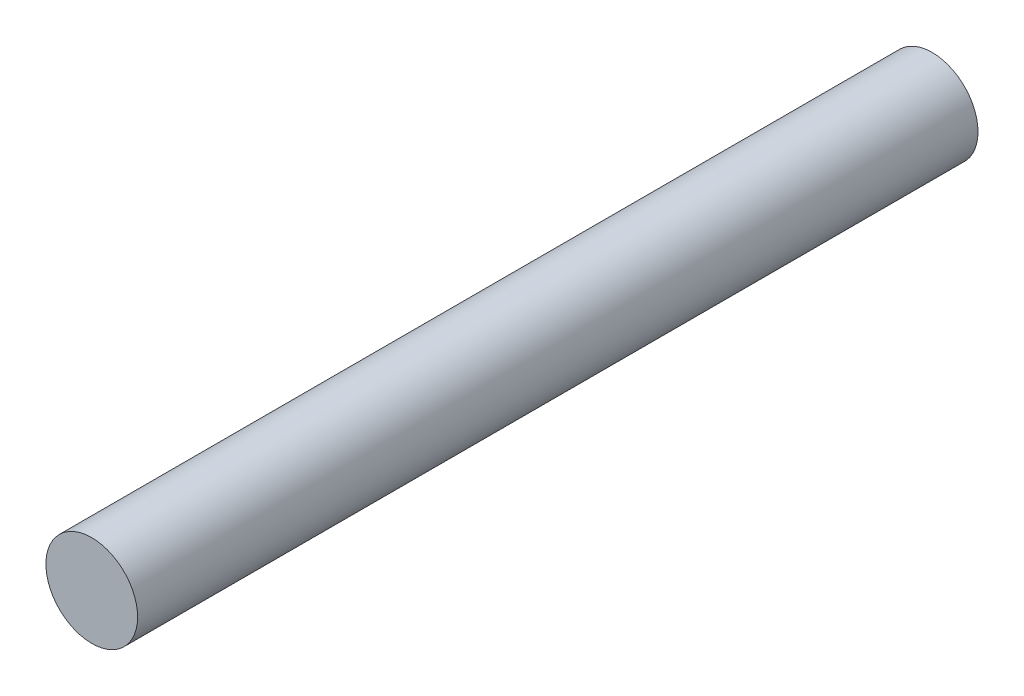
ISO-10303-21;
HEADER;
FILE_DESCRIPTION(('STEP AP214'),'2;1');
FILE_NAME('part.step','',(''),(''),'','','');
FILE_SCHEMA(('AUTOMOTIVE_DESIGN { 1 0 10303 214 1 1 1 1 }'));
ENDSEC;
DATA;
#1=APPLICATION_CONTEXT('core data for automotive mechanical design processes');
#2=APPLICATION_PROTOCOL_DEFINITION('international standard','automotive_design',2000,#1);
#3=PRODUCT_CONTEXT('',#1,'mechanical');
#4=PRODUCT('Part','Part','',(#3));
#5=PRODUCT_RELATED_PRODUCT_CATEGORY('part','',(#4));
#6=PRODUCT_DEFINITION_FORMATION('','',#4);
#7=PRODUCT_DEFINITION_CONTEXT('part definition',#1,'design');
#8=PRODUCT_DEFINITION('design','',#6,#7);
#9=PRODUCT_DEFINITION_SHAPE('','',#8);
#10=(LENGTH_UNIT() NAMED_UNIT(*) SI_UNIT(.MILLI.,.METRE.));
#11=(NAMED_UNIT(*) PLANE_ANGLE_UNIT() SI_UNIT($,.RADIAN.));
#12=(NAMED_UNIT(*) SI_UNIT($,.STERADIAN.) SOLID_ANGLE_UNIT());
#13=UNCERTAINTY_MEASURE_WITH_UNIT(LENGTH_MEASURE(1.E-05),#10,'distance_accuracy_value','');
#14=(GEOMETRIC_REPRESENTATION_CONTEXT(3) GLOBAL_UNCERTAINTY_ASSIGNED_CONTEXT((#13)) GLOBAL_UNIT_ASSIGNED_CONTEXT((#10,
#11,#12)) REPRESENTATION_CONTEXT('',''));
#15=CARTESIAN_POINT('',(0.,0.,0.));
#16=DIRECTION('',(0.,0.,1.));
#17=DIRECTION('',(1.,0.,0.));
#18=AXIS2_PLACEMENT_3D('',#15,#16,#17);
#19=CARTESIAN_POINT('',(0.,0.,44.));
#20=DIRECTION('',(0.,0.,-1.));
#21=DIRECTION('',(-1.,0.,0.));
#22=AXIS2_PLACEMENT_3D('',#19,#20,#21);
#23=CYLINDRICAL_SURFACE('',#22,2.4);
#24=CARTESIAN_POINT('',(0.,0.,44.));
#25=DIRECTION('',(0.,0.,1.));
#26=DIRECTION('',(1.,0.,0.));
#27=AXIS2_PLACEMENT_3D('',#24,#25,#26);
#28=CIRCLE('',#27,2.4);
#29=CARTESIAN_POINT('',(2.4,0.,44.));
#30=VERTEX_POINT('',#29);
#31=EDGE_CURVE('E10',#30,#30,#28,.T.);
#32=ORIENTED_EDGE('',*,*,#31,.F.);
#33=EDGE_LOOP('',(#32));
#34=FACE_BOUND('',#33,.T.);
#35=CARTESIAN_POINT('',(0.,0.,0.));
#36=DIRECTION('',(0.,0.,1.));
#37=DIRECTION('',(1.,0.,0.));
#38=AXIS2_PLACEMENT_3D('',#35,#36,#37);
#39=CIRCLE('',#38,2.4);
#40=CARTESIAN_POINT('',(2.4,0.,0.));
#41=VERTEX_POINT('',#40);
#42=EDGE_CURVE('E49',#41,#41,#39,.T.);
#43=ORIENTED_EDGE('',*,*,#42,.T.);
#44=EDGE_LOOP('',(#43));
#45=FACE_BOUND('',#44,.T.);
#46=ADVANCED_FACE('F50',(#34,#45),#23,.T.);
#47=CARTESIAN_POINT('',(0.,0.,44.));
#48=DIRECTION('',(0.,0.,1.));
#49=DIRECTION('',(1.,0.,0.));
#50=AXIS2_PLACEMENT_3D('',#47,#48,#49);
#51=PLANE('',#50);
#52=ORIENTED_EDGE('',*,*,#31,.T.);
#53=EDGE_LOOP('',(#52));
#54=FACE_BOUND('',#53,.T.);
#55=ADVANCED_FACE('F66',(#54),#51,.T.);
#56=CARTESIAN_POINT('',(0.,0.,0.));
#57=DIRECTION('',(0.,0.,1.));
#58=DIRECTION('',(1.,0.,0.));
#59=AXIS2_PLACEMENT_3D('',#56,#57,#58);
#60=PLANE('',#59);
#61=ORIENTED_EDGE('',*,*,#42,.F.);
#62=EDGE_LOOP('',(#61));
#63=FACE_BOUND('',#62,.T.);
#64=ADVANCED_FACE('F63',(#63),#60,.F.);
#65=CLOSED_SHELL('',(#46,#55,#64));
#66=MANIFOLD_SOLID_BREP('B2',#65);
#67=ADVANCED_BREP_SHAPE_REPRESENTATION('',(#18,#66),#14);
#68=SHAPE_DEFINITION_REPRESENTATION(#9,#67);
ENDSEC;
END-ISO-10303-21;
